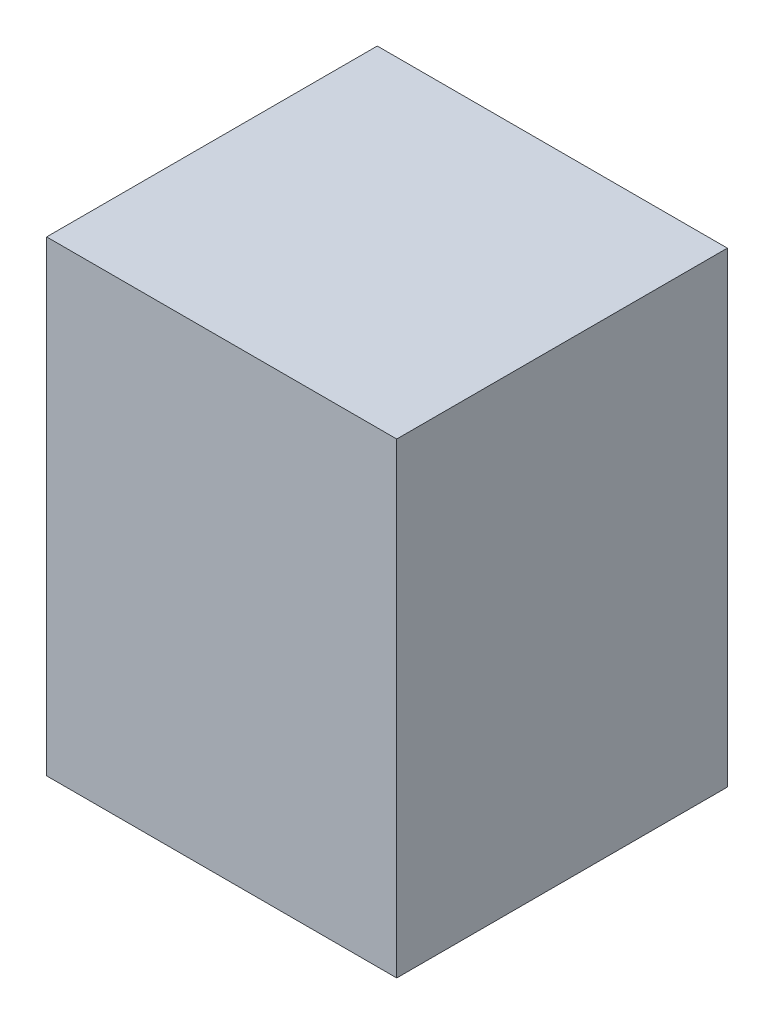
ISO-10303-21;
HEADER;
FILE_DESCRIPTION(('STEP AP214'),'2;1');
FILE_NAME('part.step','',(''),(''),'','','');
FILE_SCHEMA(('AUTOMOTIVE_DESIGN { 1 0 10303 214 1 1 1 1 }'));
ENDSEC;
DATA;
#1=APPLICATION_CONTEXT('core data for automotive mechanical design processes');
#2=APPLICATION_PROTOCOL_DEFINITION('international standard','automotive_design',2000,#1);
#3=PRODUCT_CONTEXT('',#1,'mechanical');
#4=PRODUCT('Part','Part','',(#3));
#5=PRODUCT_RELATED_PRODUCT_CATEGORY('part','',(#4));
#6=PRODUCT_DEFINITION_FORMATION('','',#4);
#7=PRODUCT_DEFINITION_CONTEXT('part definition',#1,'design');
#8=PRODUCT_DEFINITION('design','',#6,#7);
#9=PRODUCT_DEFINITION_SHAPE('','',#8);
#10=(LENGTH_UNIT() NAMED_UNIT(*) SI_UNIT(.MILLI.,.METRE.));
#11=(NAMED_UNIT(*) PLANE_ANGLE_UNIT() SI_UNIT($,.RADIAN.));
#12=(NAMED_UNIT(*) SI_UNIT($,.STERADIAN.) SOLID_ANGLE_UNIT());
#13=UNCERTAINTY_MEASURE_WITH_UNIT(LENGTH_MEASURE(1.E-05),#10,'distance_accuracy_value','');
#14=(GEOMETRIC_REPRESENTATION_CONTEXT(3) GLOBAL_UNCERTAINTY_ASSIGNED_CONTEXT((#13)) GLOBAL_UNIT_ASSIGNED_CONTEXT((#10,
#11,#12)) REPRESENTATION_CONTEXT('',''));
#15=CARTESIAN_POINT('',(0.,0.,0.));
#16=DIRECTION('',(0.,0.,1.));
#17=DIRECTION('',(1.,0.,0.));
#18=AXIS2_PLACEMENT_3D('',#15,#16,#17);
#19=CARTESIAN_POINT('',(-0.8999982,-1.20000014,1.69999914));
#20=DIRECTION('',(0.,0.,-1.));
#21=DIRECTION('',(0.,-1.,0.));
#22=AXIS2_PLACEMENT_3D('',#19,#20,#21);
#23=PLANE('',#22);
#24=DIRECTION('',(1.,0.,0.));
#25=VECTOR('',#24,1.);
#26=CARTESIAN_POINT('',(-0.8999982,-1.20000014,1.69999914));
#27=LINE('',#26,#25);
#28=CARTESIAN_POINT('',(-0.8999982,-1.20000014,1.69999914));
#29=VERTEX_POINT('',#28);
#30=CARTESIAN_POINT('',(0.90000074,-1.20000014,1.69999914));
#31=VERTEX_POINT('',#30);
#32=EDGE_CURVE('E78',#29,#31,#27,.T.);
#33=ORIENTED_EDGE('',*,*,#32,.T.);
#34=DIRECTION('',(0.,1.,0.));
#35=VECTOR('',#34,1.);
#36=CARTESIAN_POINT('',(0.90000074,-1.20000014,1.69999914));
#37=LINE('',#36,#35);
#38=CARTESIAN_POINT('',(0.90000074,1.20000014,1.69999914));
#39=VERTEX_POINT('',#38);
#40=EDGE_CURVE('E97',#31,#39,#37,.T.);
#41=ORIENTED_EDGE('',*,*,#40,.T.);
#42=DIRECTION('',(-1.,0.,0.));
#43=VECTOR('',#42,1.);
#44=CARTESIAN_POINT('',(0.90000074,1.20000014,1.69999914));
#45=LINE('',#44,#43);
#46=CARTESIAN_POINT('',(-0.8999982,1.20000014,1.69999914));
#47=VERTEX_POINT('',#46);
#48=EDGE_CURVE('E70',#39,#47,#45,.T.);
#49=ORIENTED_EDGE('',*,*,#48,.T.);
#50=DIRECTION('',(0.,-1.,0.));
#51=VECTOR('',#50,1.);
#52=CARTESIAN_POINT('',(-0.8999982,1.20000014,1.69999914));
#53=LINE('',#52,#51);
#54=EDGE_CURVE('E11',#47,#29,#53,.T.);
#55=ORIENTED_EDGE('',*,*,#54,.T.);
#56=EDGE_LOOP('',(#33,#41,#49,#55));
#57=FACE_BOUND('',#56,.T.);
#58=ADVANCED_FACE('F16',(#57),#23,.F.);
#59=CARTESIAN_POINT('',(-0.8999982,-1.20000014,0.));
#60=DIRECTION('',(0.,0.,-1.));
#61=DIRECTION('',(0.,-1.,0.));
#62=AXIS2_PLACEMENT_3D('',#59,#60,#61);
#63=PLANE('',#62);
#64=DIRECTION('',(0.,-1.,0.));
#65=VECTOR('',#64,1.);
#66=CARTESIAN_POINT('',(-0.8999982,1.20000014,0.));
#67=LINE('',#66,#65);
#68=CARTESIAN_POINT('',(-0.8999982,1.20000014,0.));
#69=VERTEX_POINT('',#68);
#70=CARTESIAN_POINT('',(-0.8999982,-1.20000014,0.));
#71=VERTEX_POINT('',#70);
#72=EDGE_CURVE('E27',#69,#71,#67,.T.);
#73=ORIENTED_EDGE('',*,*,#72,.F.);
#74=DIRECTION('',(-1.,0.,0.));
#75=VECTOR('',#74,1.);
#76=CARTESIAN_POINT('',(0.90000074,1.20000014,0.));
#77=LINE('',#76,#75);
#78=CARTESIAN_POINT('',(0.90000074,1.20000014,0.));
#79=VERTEX_POINT('',#78);
#80=EDGE_CURVE('E92',#79,#69,#77,.T.);
#81=ORIENTED_EDGE('',*,*,#80,.F.);
#82=DIRECTION('',(0.,1.,0.));
#83=VECTOR('',#82,1.);
#84=CARTESIAN_POINT('',(0.90000074,-1.20000014,0.));
#85=LINE('',#84,#83);
#86=CARTESIAN_POINT('',(0.90000074,-1.20000014,0.));
#87=VERTEX_POINT('',#86);
#88=EDGE_CURVE('E80',#87,#79,#85,.T.);
#89=ORIENTED_EDGE('',*,*,#88,.F.);
#90=DIRECTION('',(1.,0.,0.));
#91=VECTOR('',#90,1.);
#92=CARTESIAN_POINT('',(-0.8999982,-1.20000014,0.));
#93=LINE('',#92,#91);
#94=EDGE_CURVE('E76',#71,#87,#93,.T.);
#95=ORIENTED_EDGE('',*,*,#94,.F.);
#96=EDGE_LOOP('',(#73,#81,#89,#95));
#97=FACE_BOUND('',#96,.T.);
#98=ADVANCED_FACE('F18',(#97),#63,.T.);
#99=CARTESIAN_POINT('',(-0.8999982,1.20000014,0.));
#100=DIRECTION('',(1.,0.,0.));
#101=DIRECTION('',(0.,1.,0.));
#102=AXIS2_PLACEMENT_3D('',#99,#100,#101);
#103=PLANE('',#102);
#104=ORIENTED_EDGE('',*,*,#72,.T.);
#105=DIRECTION('',(0.,0.,1.));
#106=VECTOR('',#105,1.);
#107=CARTESIAN_POINT('',(-0.8999982,-1.20000014,0.));
#108=LINE('',#107,#106);
#109=EDGE_CURVE('E20',#71,#29,#108,.T.);
#110=ORIENTED_EDGE('',*,*,#109,.T.);
#111=ORIENTED_EDGE('',*,*,#54,.F.);
#112=DIRECTION('',(0.,0.,1.));
#113=VECTOR('',#112,1.);
#114=CARTESIAN_POINT('',(-0.8999982,1.20000014,0.));
#115=LINE('',#114,#113);
#116=EDGE_CURVE('E64',#69,#47,#115,.T.);
#117=ORIENTED_EDGE('',*,*,#116,.F.);
#118=EDGE_LOOP('',(#104,#110,#111,#117));
#119=FACE_BOUND('',#118,.T.);
#120=ADVANCED_FACE('F61',(#119),#103,.F.);
#121=CARTESIAN_POINT('',(0.90000074,1.20000014,0.));
#122=DIRECTION('',(0.,-1.,0.));
#123=DIRECTION('',(0.,0.,-1.));
#124=AXIS2_PLACEMENT_3D('',#121,#122,#123);
#125=PLANE('',#124);
#126=ORIENTED_EDGE('',*,*,#80,.T.);
#127=ORIENTED_EDGE('',*,*,#116,.T.);
#128=ORIENTED_EDGE('',*,*,#48,.F.);
#129=DIRECTION('',(0.,0.,1.));
#130=VECTOR('',#129,1.);
#131=CARTESIAN_POINT('',(0.90000074,1.20000014,0.));
#132=LINE('',#131,#130);
#133=EDGE_CURVE('E93',#79,#39,#132,.T.);
#134=ORIENTED_EDGE('',*,*,#133,.F.);
#135=EDGE_LOOP('',(#126,#127,#128,#134));
#136=FACE_BOUND('',#135,.T.);
#137=ADVANCED_FACE('F112',(#136),#125,.F.);
#138=CARTESIAN_POINT('',(0.90000074,-1.20000014,0.));
#139=DIRECTION('',(-1.,0.,0.));
#140=DIRECTION('',(0.,0.,1.));
#141=AXIS2_PLACEMENT_3D('',#138,#139,#140);
#142=PLANE('',#141);
#143=ORIENTED_EDGE('',*,*,#88,.T.);
#144=ORIENTED_EDGE('',*,*,#133,.T.);
#145=ORIENTED_EDGE('',*,*,#40,.F.);
#146=DIRECTION('',(0.,0.,1.));
#147=VECTOR('',#146,1.);
#148=CARTESIAN_POINT('',(0.90000074,-1.20000014,0.));
#149=LINE('',#148,#147);
#150=EDGE_CURVE('E84',#87,#31,#149,.T.);
#151=ORIENTED_EDGE('',*,*,#150,.F.);
#152=EDGE_LOOP('',(#143,#144,#145,#151));
#153=FACE_BOUND('',#152,.T.);
#154=ADVANCED_FACE('F151',(#153),#142,.F.);
#155=CARTESIAN_POINT('',(-0.8999982,-1.20000014,0.));
#156=DIRECTION('',(0.,1.,0.));
#157=DIRECTION('',(1.,0.,0.));
#158=AXIS2_PLACEMENT_3D('',#155,#156,#157);
#159=PLANE('',#158);
#160=ORIENTED_EDGE('',*,*,#94,.T.);
#161=ORIENTED_EDGE('',*,*,#150,.T.);
#162=ORIENTED_EDGE('',*,*,#32,.F.);
#163=ORIENTED_EDGE('',*,*,#109,.F.);
#164=EDGE_LOOP('',(#160,#161,#162,#163));
#165=FACE_BOUND('',#164,.T.);
#166=ADVANCED_FACE('F74',(#165),#159,.F.);
#167=CLOSED_SHELL('',(#58,#98,#120,#137,#154,#166));
#168=MANIFOLD_SOLID_BREP('B1',#167);
#169=ADVANCED_BREP_SHAPE_REPRESENTATION('',(#18,#168),#14);
#170=SHAPE_DEFINITION_REPRESENTATION(#9,#169);
ENDSEC;
END-ISO-10303-21;
